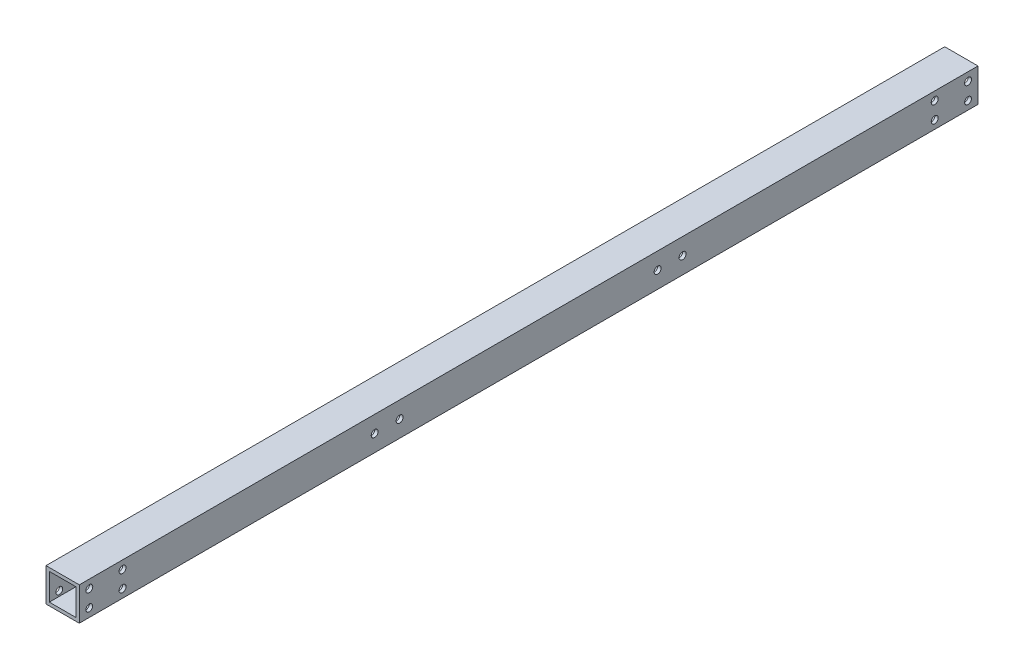
ISO-10303-21;
HEADER;
FILE_DESCRIPTION(('STEP AP214'),'2;1');
FILE_NAME('part.step','',(''),(''),'','','');
FILE_SCHEMA(('AUTOMOTIVE_DESIGN { 1 0 10303 214 1 1 1 1 }'));
ENDSEC;
DATA;
#1=APPLICATION_CONTEXT('core data for automotive mechanical design processes');
#2=APPLICATION_PROTOCOL_DEFINITION('international standard','automotive_design',2000,#1);
#3=PRODUCT_CONTEXT('',#1,'mechanical');
#4=PRODUCT('Part','Part','',(#3));
#5=PRODUCT_RELATED_PRODUCT_CATEGORY('part','',(#4));
#6=PRODUCT_DEFINITION_FORMATION('','',#4);
#7=PRODUCT_DEFINITION_CONTEXT('part definition',#1,'design');
#8=PRODUCT_DEFINITION('design','',#6,#7);
#9=PRODUCT_DEFINITION_SHAPE('','',#8);
#10=(LENGTH_UNIT() NAMED_UNIT(*) SI_UNIT(.MILLI.,.METRE.));
#11=(NAMED_UNIT(*) PLANE_ANGLE_UNIT() SI_UNIT($,.RADIAN.));
#12=(NAMED_UNIT(*) SI_UNIT($,.STERADIAN.) SOLID_ANGLE_UNIT());
#13=UNCERTAINTY_MEASURE_WITH_UNIT(LENGTH_MEASURE(1.E-05),#10,'distance_accuracy_value','');
#14=(GEOMETRIC_REPRESENTATION_CONTEXT(3) GLOBAL_UNCERTAINTY_ASSIGNED_CONTEXT((#13)) GLOBAL_UNIT_ASSIGNED_CONTEXT((#10,
#11,#12)) REPRESENTATION_CONTEXT('',''));
#15=CARTESIAN_POINT('',(0.,0.,0.));
#16=DIRECTION('',(0.,0.,1.));
#17=DIRECTION('',(1.,0.,0.));
#18=AXIS2_PLACEMENT_3D('',#15,#16,#17);
#19=CARTESIAN_POINT('',(10.,-10.,560.));
#20=DIRECTION('',(-1.,0.,0.));
#21=DIRECTION('',(0.,0.,1.));
#22=AXIS2_PLACEMENT_3D('',#19,#20,#21);
#23=PLANE('',#22);
#24=CARTESIAN_POINT('',(10.,0.,187.5));
#25=DIRECTION('',(1.,0.,0.));
#26=DIRECTION('',(0.,0.,-1.));
#27=AXIS2_PLACEMENT_3D('',#24,#25,#26);
#28=CIRCLE('',#27,2.09999999999999);
#29=CARTESIAN_POINT('',(10.,0.,185.4));
#30=VERTEX_POINT('',#29);
#31=EDGE_CURVE('E306',#30,#30,#28,.T.);
#32=ORIENTED_EDGE('',*,*,#31,.F.);
#33=EDGE_LOOP('',(#32));
#34=FACE_BOUND('',#33,.T.);
#35=CARTESIAN_POINT('',(10.,0.,202.5));
#36=DIRECTION('',(1.,0.,0.));
#37=DIRECTION('',(0.,0.,-1.));
#38=AXIS2_PLACEMENT_3D('',#35,#36,#37);
#39=CIRCLE('',#38,2.09999999999999);
#40=CARTESIAN_POINT('',(10.,0.,200.4));
#41=VERTEX_POINT('',#40);
#42=EDGE_CURVE('E310',#41,#41,#39,.T.);
#43=ORIENTED_EDGE('',*,*,#42,.F.);
#44=EDGE_LOOP('',(#43));
#45=FACE_BOUND('',#44,.T.);
#46=CARTESIAN_POINT('',(10.,0.,357.5));
#47=DIRECTION('',(1.,0.,0.));
#48=DIRECTION('',(0.,0.,1.));
#49=AXIS2_PLACEMENT_3D('',#46,#47,#48);
#50=CIRCLE('',#49,2.09999999999999);
#51=CARTESIAN_POINT('',(10.,0.,359.6));
#52=VERTEX_POINT('',#51);
#53=EDGE_CURVE('E314',#52,#52,#50,.T.);
#54=ORIENTED_EDGE('',*,*,#53,.F.);
#55=EDGE_LOOP('',(#54));
#56=FACE_BOUND('',#55,.T.);
#57=CARTESIAN_POINT('',(10.,0.,372.5));
#58=DIRECTION('',(1.,0.,0.));
#59=DIRECTION('',(0.,0.,1.));
#60=AXIS2_PLACEMENT_3D('',#57,#58,#59);
#61=CIRCLE('',#60,2.09999999999999);
#62=CARTESIAN_POINT('',(10.,0.,374.6));
#63=VERTEX_POINT('',#62);
#64=EDGE_CURVE('E318',#63,#63,#61,.T.);
#65=ORIENTED_EDGE('',*,*,#64,.F.);
#66=EDGE_LOOP('',(#65));
#67=FACE_BOUND('',#66,.T.);
#68=CARTESIAN_POINT('',(10.,5.00000000000002,543.999999999998));
#69=DIRECTION('',(1.,0.,0.));
#70=DIRECTION('',(0.,0.,1.));
#71=AXIS2_PLACEMENT_3D('',#68,#69,#70);
#72=CIRCLE('',#71,2.09999999999994);
#73=CARTESIAN_POINT('',(10.,5.00000000000002,546.099999999998));
#74=VERTEX_POINT('',#73);
#75=EDGE_CURVE('E186',#74,#74,#72,.T.);
#76=ORIENTED_EDGE('',*,*,#75,.F.);
#77=EDGE_LOOP('',(#76));
#78=FACE_BOUND('',#77,.T.);
#79=CARTESIAN_POINT('',(10.,-4.99999999999997,36.0000000000022));
#80=DIRECTION('',(1.,0.,0.));
#81=DIRECTION('',(0.,0.,-1.));
#82=AXIS2_PLACEMENT_3D('',#79,#80,#81);
#83=CIRCLE('',#82,2.1);
#84=CARTESIAN_POINT('',(10.,-4.99999999999997,33.9000000000022));
#85=VERTEX_POINT('',#84);
#86=EDGE_CURVE('E205',#85,#85,#83,.T.);
#87=ORIENTED_EDGE('',*,*,#86,.F.);
#88=EDGE_LOOP('',(#87));
#89=FACE_BOUND('',#88,.T.);
#90=CARTESIAN_POINT('',(10.,5.00000000000002,36.0000000000022));
#91=DIRECTION('',(1.,0.,0.));
#92=DIRECTION('',(0.,0.,-1.));
#93=AXIS2_PLACEMENT_3D('',#90,#91,#92);
#94=CIRCLE('',#93,2.1);
#95=CARTESIAN_POINT('',(10.,5.00000000000002,33.9000000000022));
#96=VERTEX_POINT('',#95);
#97=EDGE_CURVE('E204',#96,#96,#94,.T.);
#98=ORIENTED_EDGE('',*,*,#97,.F.);
#99=EDGE_LOOP('',(#98));
#100=FACE_BOUND('',#99,.T.);
#101=CARTESIAN_POINT('',(10.,-4.99999999999997,16.0000000000022));
#102=DIRECTION('',(1.,0.,0.));
#103=DIRECTION('',(0.,0.,-1.));
#104=AXIS2_PLACEMENT_3D('',#101,#102,#103);
#105=CIRCLE('',#104,2.03527278510448);
#106=CARTESIAN_POINT('',(10.,-4.99999999999997,13.9647272148977));
#107=VERTEX_POINT('',#106);
#108=EDGE_CURVE('E217',#107,#107,#105,.T.);
#109=ORIENTED_EDGE('',*,*,#108,.F.);
#110=EDGE_LOOP('',(#109));
#111=FACE_BOUND('',#110,.T.);
#112=CARTESIAN_POINT('',(10.,-4.99999999999997,543.999999999998));
#113=DIRECTION('',(1.,0.,0.));
#114=DIRECTION('',(0.,0.,1.));
#115=AXIS2_PLACEMENT_3D('',#112,#113,#114);
#116=CIRCLE('',#115,2.03527278510447);
#117=CARTESIAN_POINT('',(10.,-4.99999999999997,546.035272785102));
#118=VERTEX_POINT('',#117);
#119=EDGE_CURVE('E187',#118,#118,#116,.T.);
#120=ORIENTED_EDGE('',*,*,#119,.F.);
#121=EDGE_LOOP('',(#120));
#122=FACE_BOUND('',#121,.T.);
#123=CARTESIAN_POINT('',(10.,-4.99999999999997,523.999999999998));
#124=DIRECTION('',(1.,0.,0.));
#125=DIRECTION('',(0.,0.,1.));
#126=AXIS2_PLACEMENT_3D('',#123,#124,#125);
#127=CIRCLE('',#126,2.10000000000004);
#128=CARTESIAN_POINT('',(10.,-4.99999999999997,526.099999999998));
#129=VERTEX_POINT('',#128);
#130=EDGE_CURVE('E193',#129,#129,#127,.T.);
#131=ORIENTED_EDGE('',*,*,#130,.F.);
#132=EDGE_LOOP('',(#131));
#133=FACE_BOUND('',#132,.T.);
#134=CARTESIAN_POINT('',(10.,5.00000000000002,523.999999999998));
#135=DIRECTION('',(1.,0.,0.));
#136=DIRECTION('',(0.,0.,1.));
#137=AXIS2_PLACEMENT_3D('',#134,#135,#136);
#138=CIRCLE('',#137,2.10000000000004);
#139=CARTESIAN_POINT('',(10.,5.00000000000002,526.099999999998));
#140=VERTEX_POINT('',#139);
#141=EDGE_CURVE('E182',#140,#140,#138,.T.);
#142=ORIENTED_EDGE('',*,*,#141,.F.);
#143=EDGE_LOOP('',(#142));
#144=FACE_BOUND('',#143,.T.);
#145=CARTESIAN_POINT('',(10.,5.00000000000002,16.0000000000022));
#146=DIRECTION('',(1.,0.,0.));
#147=DIRECTION('',(0.,0.,-1.));
#148=AXIS2_PLACEMENT_3D('',#145,#146,#147);
#149=CIRCLE('',#148,2.1);
#150=CARTESIAN_POINT('',(10.,5.00000000000002,13.9000000000022));
#151=VERTEX_POINT('',#150);
#152=EDGE_CURVE('E216',#151,#151,#149,.T.);
#153=ORIENTED_EDGE('',*,*,#152,.F.);
#154=EDGE_LOOP('',(#153));
#155=FACE_BOUND('',#154,.T.);
#156=DIRECTION('',(0.,0.,-1.));
#157=VECTOR('',#156,1.);
#158=CARTESIAN_POINT('',(10.,10.,560.));
#159=LINE('',#158,#157);
#160=CARTESIAN_POINT('',(9.99999999999995,10.,550.));
#161=VERTEX_POINT('',#160);
#162=CARTESIAN_POINT('',(10.,10.,10.));
#163=VERTEX_POINT('',#162);
#164=EDGE_CURVE('E111',#161,#163,#159,.T.);
#165=ORIENTED_EDGE('',*,*,#164,.F.);
#166=DIRECTION('',(0.,-1.,0.));
#167=VECTOR('',#166,1.);
#168=CARTESIAN_POINT('',(9.99999999999995,-10.,550.));
#169=LINE('',#168,#167);
#170=CARTESIAN_POINT('',(9.99999999999995,-10.,550.));
#171=VERTEX_POINT('',#170);
#172=EDGE_CURVE('E97',#161,#171,#169,.T.);
#173=ORIENTED_EDGE('',*,*,#172,.T.);
#174=DIRECTION('',(0.,0.,-1.));
#175=VECTOR('',#174,1.);
#176=CARTESIAN_POINT('',(10.,-10.,560.));
#177=LINE('',#176,#175);
#178=CARTESIAN_POINT('',(10.,-10.,10.));
#179=VERTEX_POINT('',#178);
#180=EDGE_CURVE('E278',#171,#179,#177,.T.);
#181=ORIENTED_EDGE('',*,*,#180,.T.);
#182=DIRECTION('',(0.,-1.,0.));
#183=VECTOR('',#182,1.);
#184=CARTESIAN_POINT('',(10.,-10.,10.));
#185=LINE('',#184,#183);
#186=EDGE_CURVE('E117',#163,#179,#185,.T.);
#187=ORIENTED_EDGE('',*,*,#186,.F.);
#188=EDGE_LOOP('',(#165,#173,#181,#187));
#189=FACE_BOUND('',#188,.T.);
#190=ADVANCED_FACE('F34',(#34,#45,#56,#67,#78,#89,#100,#111,#122,#133,#144,#155,#189),#23,.F.);
#191=CARTESIAN_POINT('',(-9.99999999999999,10.,560.));
#192=DIRECTION('',(0.,-1.,0.));
#193=DIRECTION('',(0.,0.,-1.));
#194=AXIS2_PLACEMENT_3D('',#191,#192,#193);
#195=PLANE('',#194);
#196=DIRECTION('',(0.,0.,-1.));
#197=VECTOR('',#196,1.);
#198=CARTESIAN_POINT('',(-9.99999999999999,10.,560.));
#199=LINE('',#198,#197);
#200=CARTESIAN_POINT('',(-10.,10.,550.));
#201=VERTEX_POINT('',#200);
#202=CARTESIAN_POINT('',(-9.99999999999999,10.,10.));
#203=VERTEX_POINT('',#202);
#204=EDGE_CURVE('E113',#201,#203,#199,.T.);
#205=ORIENTED_EDGE('',*,*,#204,.F.);
#206=DIRECTION('',(1.,0.,0.));
#207=VECTOR('',#206,1.);
#208=CARTESIAN_POINT('',(9.99999999999995,10.,550.));
#209=LINE('',#208,#207);
#210=EDGE_CURVE('E100',#201,#161,#209,.T.);
#211=ORIENTED_EDGE('',*,*,#210,.T.);
#212=ORIENTED_EDGE('',*,*,#164,.T.);
#213=DIRECTION('',(1.,0.,0.));
#214=VECTOR('',#213,1.);
#215=CARTESIAN_POINT('',(10.,10.,10.));
#216=LINE('',#215,#214);
#217=EDGE_CURVE('E259',#203,#163,#216,.T.);
#218=ORIENTED_EDGE('',*,*,#217,.F.);
#219=EDGE_LOOP('',(#205,#211,#212,#218));
#220=FACE_BOUND('',#219,.T.);
#221=ADVANCED_FACE('F109',(#220),#195,.F.);
#222=CARTESIAN_POINT('',(-9.99999999999999,-10.,560.));
#223=DIRECTION('',(1.,0.,0.));
#224=DIRECTION('',(0.,0.,-1.));
#225=AXIS2_PLACEMENT_3D('',#222,#223,#224);
#226=PLANE('',#225);
#227=CARTESIAN_POINT('',(-10.,0.,187.5));
#228=DIRECTION('',(1.,0.,0.));
#229=DIRECTION('',(0.,0.,-1.));
#230=AXIS2_PLACEMENT_3D('',#227,#228,#229);
#231=CIRCLE('',#230,2.09999999999999);
#232=CARTESIAN_POINT('',(-10.,0.,185.4));
#233=VERTEX_POINT('',#232);
#234=EDGE_CURVE('E161',#233,#233,#231,.T.);
#235=ORIENTED_EDGE('',*,*,#234,.T.);
#236=EDGE_LOOP('',(#235));
#237=FACE_BOUND('',#236,.T.);
#238=CARTESIAN_POINT('',(-10.,0.,202.5));
#239=DIRECTION('',(1.,0.,0.));
#240=DIRECTION('',(0.,0.,-1.));
#241=AXIS2_PLACEMENT_3D('',#238,#239,#240);
#242=CIRCLE('',#241,2.09999999999999);
#243=CARTESIAN_POINT('',(-10.,0.,200.4));
#244=VERTEX_POINT('',#243);
#245=EDGE_CURVE('E640',#244,#244,#242,.T.);
#246=ORIENTED_EDGE('',*,*,#245,.T.);
#247=EDGE_LOOP('',(#246));
#248=FACE_BOUND('',#247,.T.);
#249=CARTESIAN_POINT('',(-10.,0.,357.5));
#250=DIRECTION('',(1.,0.,0.));
#251=DIRECTION('',(0.,0.,1.));
#252=AXIS2_PLACEMENT_3D('',#249,#250,#251);
#253=CIRCLE('',#252,2.09999999999999);
#254=CARTESIAN_POINT('',(-10.,0.,359.6));
#255=VERTEX_POINT('',#254);
#256=EDGE_CURVE('E647',#255,#255,#253,.T.);
#257=ORIENTED_EDGE('',*,*,#256,.T.);
#258=EDGE_LOOP('',(#257));
#259=FACE_BOUND('',#258,.T.);
#260=CARTESIAN_POINT('',(-10.,0.,372.5));
#261=DIRECTION('',(1.,0.,0.));
#262=DIRECTION('',(0.,0.,1.));
#263=AXIS2_PLACEMENT_3D('',#260,#261,#262);
#264=CIRCLE('',#263,2.09999999999999);
#265=CARTESIAN_POINT('',(-10.,0.,374.6));
#266=VERTEX_POINT('',#265);
#267=EDGE_CURVE('E651',#266,#266,#264,.T.);
#268=ORIENTED_EDGE('',*,*,#267,.T.);
#269=EDGE_LOOP('',(#268));
#270=FACE_BOUND('',#269,.T.);
#271=CARTESIAN_POINT('',(-10.,5.00000000000002,543.999999999998));
#272=DIRECTION('',(1.,0.,0.));
#273=DIRECTION('',(0.,0.,1.));
#274=AXIS2_PLACEMENT_3D('',#271,#272,#273);
#275=CIRCLE('',#274,2.09999999999994);
#276=CARTESIAN_POINT('',(-10.,5.00000000000002,546.099999999998));
#277=VERTEX_POINT('',#276);
#278=EDGE_CURVE('E208',#277,#277,#275,.T.);
#279=ORIENTED_EDGE('',*,*,#278,.T.);
#280=EDGE_LOOP('',(#279));
#281=FACE_BOUND('',#280,.T.);
#282=CARTESIAN_POINT('',(-10.,-4.99999999999997,36.0000000000022));
#283=DIRECTION('',(1.,0.,0.));
#284=DIRECTION('',(0.,0.,-1.));
#285=AXIS2_PLACEMENT_3D('',#282,#283,#284);
#286=CIRCLE('',#285,2.1);
#287=CARTESIAN_POINT('',(-10.,-4.99999999999997,33.9000000000022));
#288=VERTEX_POINT('',#287);
#289=EDGE_CURVE('E201',#288,#288,#286,.T.);
#290=ORIENTED_EDGE('',*,*,#289,.T.);
#291=EDGE_LOOP('',(#290));
#292=FACE_BOUND('',#291,.T.);
#293=CARTESIAN_POINT('',(-10.,5.00000000000002,36.0000000000022));
#294=DIRECTION('',(1.,0.,0.));
#295=DIRECTION('',(0.,0.,-1.));
#296=AXIS2_PLACEMENT_3D('',#293,#294,#295);
#297=CIRCLE('',#296,2.1);
#298=CARTESIAN_POINT('',(-10.,5.00000000000002,33.9000000000022));
#299=VERTEX_POINT('',#298);
#300=EDGE_CURVE('E220',#299,#299,#297,.T.);
#301=ORIENTED_EDGE('',*,*,#300,.T.);
#302=EDGE_LOOP('',(#301));
#303=FACE_BOUND('',#302,.T.);
#304=CARTESIAN_POINT('',(-10.,-4.99999999999997,16.0000000000022));
#305=DIRECTION('',(1.,0.,0.));
#306=DIRECTION('',(0.,0.,-1.));
#307=AXIS2_PLACEMENT_3D('',#304,#305,#306);
#308=CIRCLE('',#307,2.03527278510448);
#309=CARTESIAN_POINT('',(-10.,-4.99999999999997,13.9647272148977));
#310=VERTEX_POINT('',#309);
#311=EDGE_CURVE('E213',#310,#310,#308,.T.);
#312=ORIENTED_EDGE('',*,*,#311,.T.);
#313=EDGE_LOOP('',(#312));
#314=FACE_BOUND('',#313,.T.);
#315=CARTESIAN_POINT('',(-10.,-4.99999999999997,543.999999999998));
#316=DIRECTION('',(1.,0.,0.));
#317=DIRECTION('',(0.,0.,1.));
#318=AXIS2_PLACEMENT_3D('',#315,#316,#317);
#319=CIRCLE('',#318,2.03527278510447);
#320=CARTESIAN_POINT('',(-10.,-4.99999999999997,546.035272785102));
#321=VERTEX_POINT('',#320);
#322=EDGE_CURVE('E183',#321,#321,#319,.T.);
#323=ORIENTED_EDGE('',*,*,#322,.T.);
#324=EDGE_LOOP('',(#323));
#325=FACE_BOUND('',#324,.T.);
#326=CARTESIAN_POINT('',(-10.,-4.99999999999997,523.999999999998));
#327=DIRECTION('',(1.,0.,0.));
#328=DIRECTION('',(0.,0.,1.));
#329=AXIS2_PLACEMENT_3D('',#326,#327,#328);
#330=CIRCLE('',#329,2.10000000000004);
#331=CARTESIAN_POINT('',(-10.,-4.99999999999997,526.099999999998));
#332=VERTEX_POINT('',#331);
#333=EDGE_CURVE('E190',#332,#332,#330,.T.);
#334=ORIENTED_EDGE('',*,*,#333,.T.);
#335=EDGE_LOOP('',(#334));
#336=FACE_BOUND('',#335,.T.);
#337=CARTESIAN_POINT('',(-10.,5.00000000000002,523.999999999998));
#338=DIRECTION('',(1.,0.,0.));
#339=DIRECTION('',(0.,0.,1.));
#340=AXIS2_PLACEMENT_3D('',#337,#338,#339);
#341=CIRCLE('',#340,2.10000000000004);
#342=CARTESIAN_POINT('',(-10.,5.00000000000002,526.099999999998));
#343=VERTEX_POINT('',#342);
#344=EDGE_CURVE('E196',#343,#343,#341,.T.);
#345=ORIENTED_EDGE('',*,*,#344,.T.);
#346=EDGE_LOOP('',(#345));
#347=FACE_BOUND('',#346,.T.);
#348=CARTESIAN_POINT('',(-10.,5.00000000000002,16.0000000000022));
#349=DIRECTION('',(1.,0.,0.));
#350=DIRECTION('',(0.,0.,-1.));
#351=AXIS2_PLACEMENT_3D('',#348,#349,#350);
#352=CIRCLE('',#351,2.1);
#353=CARTESIAN_POINT('',(-10.,5.00000000000002,13.9000000000022));
#354=VERTEX_POINT('',#353);
#355=EDGE_CURVE('E129',#354,#354,#352,.T.);
#356=ORIENTED_EDGE('',*,*,#355,.T.);
#357=EDGE_LOOP('',(#356));
#358=FACE_BOUND('',#357,.T.);
#359=DIRECTION('',(0.,0.,-1.));
#360=VECTOR('',#359,1.);
#361=CARTESIAN_POINT('',(-9.99999999999999,-10.,560.));
#362=LINE('',#361,#360);
#363=CARTESIAN_POINT('',(-9.99999999999999,-10.,550.));
#364=VERTEX_POINT('',#363);
#365=CARTESIAN_POINT('',(-9.99999999999999,-10.,10.));
#366=VERTEX_POINT('',#365);
#367=EDGE_CURVE('E121',#364,#366,#362,.T.);
#368=ORIENTED_EDGE('',*,*,#367,.F.);
#369=DIRECTION('',(0.,1.,0.));
#370=VECTOR('',#369,1.);
#371=CARTESIAN_POINT('',(-10.,-10.,550.));
#372=LINE('',#371,#370);
#373=EDGE_CURVE('E50',#364,#201,#372,.T.);
#374=ORIENTED_EDGE('',*,*,#373,.T.);
#375=ORIENTED_EDGE('',*,*,#204,.T.);
#376=DIRECTION('',(0.,1.,0.));
#377=VECTOR('',#376,1.);
#378=CARTESIAN_POINT('',(-9.99999999999999,-10.,10.));
#379=LINE('',#378,#377);
#380=EDGE_CURVE('E256',#366,#203,#379,.T.);
#381=ORIENTED_EDGE('',*,*,#380,.F.);
#382=EDGE_LOOP('',(#368,#374,#375,#381));
#383=FACE_BOUND('',#382,.T.);
#384=ADVANCED_FACE('F287',(#237,#248,#259,#270,#281,#292,#303,#314,#325,#336,#347,#358,#383),
#226,.F.);
#385=CARTESIAN_POINT('',(-9.99999999999999,-10.,560.));
#386=DIRECTION('',(0.,1.,0.));
#387=DIRECTION('',(0.,0.,1.));
#388=AXIS2_PLACEMENT_3D('',#385,#386,#387);
#389=PLANE('',#388);
#390=ORIENTED_EDGE('',*,*,#180,.F.);
#391=DIRECTION('',(-1.,0.,0.));
#392=VECTOR('',#391,1.);
#393=CARTESIAN_POINT('',(9.99999999999995,-10.,550.));
#394=LINE('',#393,#392);
#395=EDGE_CURVE('E101',#171,#364,#394,.T.);
#396=ORIENTED_EDGE('',*,*,#395,.T.);
#397=ORIENTED_EDGE('',*,*,#367,.T.);
#398=DIRECTION('',(-1.,0.,0.));
#399=VECTOR('',#398,1.);
#400=CARTESIAN_POINT('',(10.,-10.,10.));
#401=LINE('',#400,#399);
#402=EDGE_CURVE('E253',#179,#366,#401,.T.);
#403=ORIENTED_EDGE('',*,*,#402,.F.);
#404=EDGE_LOOP('',(#390,#396,#397,#403));
#405=FACE_BOUND('',#404,.T.);
#406=ADVANCED_FACE('F282',(#405),#389,.F.);
#407=CARTESIAN_POINT('',(8.00000000000001,-8.,560.));
#408=DIRECTION('',(-1.,0.,0.));
#409=DIRECTION('',(0.,0.,1.));
#410=AXIS2_PLACEMENT_3D('',#407,#408,#409);
#411=PLANE('',#410);
#412=CARTESIAN_POINT('',(8.,0.,187.5));
#413=DIRECTION('',(-1.,0.,0.));
#414=DIRECTION('',(0.,0.,1.));
#415=AXIS2_PLACEMENT_3D('',#412,#413,#414);
#416=CIRCLE('',#415,2.09999999999999);
#417=CARTESIAN_POINT('',(8.,0.,189.6));
#418=VERTEX_POINT('',#417);
#419=EDGE_CURVE('E179',#418,#418,#416,.T.);
#420=ORIENTED_EDGE('',*,*,#419,.F.);
#421=EDGE_LOOP('',(#420));
#422=FACE_BOUND('',#421,.T.);
#423=CARTESIAN_POINT('',(8.,0.,202.5));
#424=DIRECTION('',(-1.,0.,0.));
#425=DIRECTION('',(0.,0.,1.));
#426=AXIS2_PLACEMENT_3D('',#423,#424,#425);
#427=CIRCLE('',#426,2.09999999999999);
#428=CARTESIAN_POINT('',(8.,0.,204.6));
#429=VERTEX_POINT('',#428);
#430=EDGE_CURVE('E167',#429,#429,#427,.T.);
#431=ORIENTED_EDGE('',*,*,#430,.F.);
#432=EDGE_LOOP('',(#431));
#433=FACE_BOUND('',#432,.T.);
#434=CARTESIAN_POINT('',(8.,0.,357.5));
#435=DIRECTION('',(-1.,0.,0.));
#436=DIRECTION('',(0.,0.,1.));
#437=AXIS2_PLACEMENT_3D('',#434,#435,#436);
#438=CIRCLE('',#437,2.09999999999999);
#439=CARTESIAN_POINT('',(8.,0.,359.6));
#440=VERTEX_POINT('',#439);
#441=EDGE_CURVE('E164',#440,#440,#438,.T.);
#442=ORIENTED_EDGE('',*,*,#441,.F.);
#443=EDGE_LOOP('',(#442));
#444=FACE_BOUND('',#443,.T.);
#445=CARTESIAN_POINT('',(8.,0.,372.5));
#446=DIRECTION('',(-1.,0.,0.));
#447=DIRECTION('',(0.,0.,1.));
#448=AXIS2_PLACEMENT_3D('',#445,#446,#447);
#449=CIRCLE('',#448,2.09999999999999);
#450=CARTESIAN_POINT('',(8.,0.,374.6));
#451=VERTEX_POINT('',#450);
#452=EDGE_CURVE('E160',#451,#451,#449,.T.);
#453=ORIENTED_EDGE('',*,*,#452,.F.);
#454=EDGE_LOOP('',(#453));
#455=FACE_BOUND('',#454,.T.);
#456=CARTESIAN_POINT('',(8.,5.00000000000002,543.999999999998));
#457=DIRECTION('',(-1.,0.,0.));
#458=DIRECTION('',(0.,0.,1.));
#459=AXIS2_PLACEMENT_3D('',#456,#457,#458);
#460=CIRCLE('',#459,2.09999999999994);
#461=CARTESIAN_POINT('',(8.,5.00000000000002,546.099999999998));
#462=VERTEX_POINT('',#461);
#463=EDGE_CURVE('E105',#462,#462,#460,.T.);
#464=ORIENTED_EDGE('',*,*,#463,.F.);
#465=EDGE_LOOP('',(#464));
#466=FACE_BOUND('',#465,.T.);
#467=CARTESIAN_POINT('',(8.,-4.99999999999997,36.0000000000022));
#468=DIRECTION('',(-1.,0.,0.));
#469=DIRECTION('',(0.,0.,1.));
#470=AXIS2_PLACEMENT_3D('',#467,#468,#469);
#471=CIRCLE('',#470,2.1);
#472=CARTESIAN_POINT('',(8.,-4.99999999999997,38.1000000000022));
#473=VERTEX_POINT('',#472);
#474=EDGE_CURVE('E153',#473,#473,#471,.T.);
#475=ORIENTED_EDGE('',*,*,#474,.F.);
#476=EDGE_LOOP('',(#475));
#477=FACE_BOUND('',#476,.T.);
#478=CARTESIAN_POINT('',(8.,5.00000000000002,36.0000000000022));
#479=DIRECTION('',(-1.,0.,0.));
#480=DIRECTION('',(0.,0.,1.));
#481=AXIS2_PLACEMENT_3D('',#478,#479,#480);
#482=CIRCLE('',#481,2.1);
#483=CARTESIAN_POINT('',(8.,5.00000000000002,38.1000000000022));
#484=VERTEX_POINT('',#483);
#485=EDGE_CURVE('E149',#484,#484,#482,.T.);
#486=ORIENTED_EDGE('',*,*,#485,.F.);
#487=EDGE_LOOP('',(#486));
#488=FACE_BOUND('',#487,.T.);
#489=CARTESIAN_POINT('',(8.,-4.99999999999997,16.0000000000022));
#490=DIRECTION('',(-1.,0.,0.));
#491=DIRECTION('',(0.,0.,1.));
#492=AXIS2_PLACEMENT_3D('',#489,#490,#491);
#493=CIRCLE('',#492,2.03527278510448);
#494=CARTESIAN_POINT('',(8.,-4.99999999999997,18.0352727851067));
#495=VERTEX_POINT('',#494);
#496=EDGE_CURVE('E145',#495,#495,#493,.T.);
#497=ORIENTED_EDGE('',*,*,#496,.F.);
#498=EDGE_LOOP('',(#497));
#499=FACE_BOUND('',#498,.T.);
#500=CARTESIAN_POINT('',(8.,-4.99999999999997,543.999999999998));
#501=DIRECTION('',(-1.,0.,0.));
#502=DIRECTION('',(0.,0.,1.));
#503=AXIS2_PLACEMENT_3D('',#500,#501,#502);
#504=CIRCLE('',#503,2.03527278510447);
#505=CARTESIAN_POINT('',(8.,-4.99999999999997,546.035272785102));
#506=VERTEX_POINT('',#505);
#507=EDGE_CURVE('E141',#506,#506,#504,.T.);
#508=ORIENTED_EDGE('',*,*,#507,.F.);
#509=EDGE_LOOP('',(#508));
#510=FACE_BOUND('',#509,.T.);
#511=CARTESIAN_POINT('',(8.,-4.99999999999997,523.999999999998));
#512=DIRECTION('',(-1.,0.,0.));
#513=DIRECTION('',(0.,0.,1.));
#514=AXIS2_PLACEMENT_3D('',#511,#512,#513);
#515=CIRCLE('',#514,2.10000000000004);
#516=CARTESIAN_POINT('',(8.,-4.99999999999997,526.099999999998));
#517=VERTEX_POINT('',#516);
#518=EDGE_CURVE('E137',#517,#517,#515,.T.);
#519=ORIENTED_EDGE('',*,*,#518,.F.);
#520=EDGE_LOOP('',(#519));
#521=FACE_BOUND('',#520,.T.);
#522=CARTESIAN_POINT('',(8.,5.00000000000002,523.999999999998));
#523=DIRECTION('',(-1.,0.,0.));
#524=DIRECTION('',(0.,0.,1.));
#525=AXIS2_PLACEMENT_3D('',#522,#523,#524);
#526=CIRCLE('',#525,2.10000000000004);
#527=CARTESIAN_POINT('',(8.,5.00000000000002,526.099999999998));
#528=VERTEX_POINT('',#527);
#529=EDGE_CURVE('E133',#528,#528,#526,.T.);
#530=ORIENTED_EDGE('',*,*,#529,.F.);
#531=EDGE_LOOP('',(#530));
#532=FACE_BOUND('',#531,.T.);
#533=CARTESIAN_POINT('',(8.,5.00000000000002,16.0000000000022));
#534=DIRECTION('',(-1.,0.,0.));
#535=DIRECTION('',(0.,0.,1.));
#536=AXIS2_PLACEMENT_3D('',#533,#534,#535);
#537=CIRCLE('',#536,2.1);
#538=CARTESIAN_POINT('',(8.,5.00000000000002,18.1000000000022));
#539=VERTEX_POINT('',#538);
#540=EDGE_CURVE('E128',#539,#539,#537,.T.);
#541=ORIENTED_EDGE('',*,*,#540,.F.);
#542=EDGE_LOOP('',(#541));
#543=FACE_BOUND('',#542,.T.);
#544=DIRECTION('',(0.,-1.,0.));
#545=VECTOR('',#544,1.);
#546=CARTESIAN_POINT('',(8.00000000000001,-8.,550.));
#547=LINE('',#546,#545);
#548=CARTESIAN_POINT('',(8.00000000000001,7.99999999999999,550.));
#549=VERTEX_POINT('',#548);
#550=CARTESIAN_POINT('',(8.00000000000001,-8.,550.));
#551=VERTEX_POINT('',#550);
#552=EDGE_CURVE('E57',#549,#551,#547,.T.);
#553=ORIENTED_EDGE('',*,*,#552,.F.);
#554=DIRECTION('',(0.,0.,-1.));
#555=VECTOR('',#554,1.);
#556=CARTESIAN_POINT('',(8.00000000000001,7.99999999999999,560.));
#557=LINE('',#556,#555);
#558=CARTESIAN_POINT('',(8.,7.99999999999999,10.));
#559=VERTEX_POINT('',#558);
#560=EDGE_CURVE('E276',#549,#559,#557,.T.);
#561=ORIENTED_EDGE('',*,*,#560,.T.);
#562=DIRECTION('',(0.,1.,0.));
#563=VECTOR('',#562,1.);
#564=CARTESIAN_POINT('',(8.00000000000001,-8.,10.));
#565=LINE('',#564,#563);
#566=CARTESIAN_POINT('',(8.,-8.,10.));
#567=VERTEX_POINT('',#566);
#568=EDGE_CURVE('E267',#567,#559,#565,.T.);
#569=ORIENTED_EDGE('',*,*,#568,.F.);
#570=DIRECTION('',(0.,0.,-1.));
#571=VECTOR('',#570,1.);
#572=CARTESIAN_POINT('',(8.00000000000001,-8.,560.));
#573=LINE('',#572,#571);
#574=EDGE_CURVE('E270',#551,#567,#573,.T.);
#575=ORIENTED_EDGE('',*,*,#574,.F.);
#576=EDGE_LOOP('',(#553,#561,#569,#575));
#577=FACE_BOUND('',#576,.T.);
#578=ADVANCED_FACE('F295',(#422,#433,#444,#455,#466,#477,#488,#499,#510,#521,#532,#543,#577),
#411,.T.);
#579=CARTESIAN_POINT('',(-8.,7.99999999999999,560.));
#580=DIRECTION('',(0.,-1.,0.));
#581=DIRECTION('',(0.,0.,-1.));
#582=AXIS2_PLACEMENT_3D('',#579,#580,#581);
#583=PLANE('',#582);
#584=DIRECTION('',(1.,0.,0.));
#585=VECTOR('',#584,1.);
#586=CARTESIAN_POINT('',(-7.99999999999999,7.99999999999999,550.));
#587=LINE('',#586,#585);
#588=CARTESIAN_POINT('',(-8.,7.99999999999999,550.));
#589=VERTEX_POINT('',#588);
#590=EDGE_CURVE('E249',#589,#549,#587,.T.);
#591=ORIENTED_EDGE('',*,*,#590,.F.);
#592=DIRECTION('',(0.,0.,-1.));
#593=VECTOR('',#592,1.);
#594=CARTESIAN_POINT('',(-8.,7.99999999999999,560.));
#595=LINE('',#594,#593);
#596=CARTESIAN_POINT('',(-8.,7.99999999999999,10.));
#597=VERTEX_POINT('',#596);
#598=EDGE_CURVE('E274',#589,#597,#595,.T.);
#599=ORIENTED_EDGE('',*,*,#598,.T.);
#600=DIRECTION('',(-1.,0.,0.));
#601=VECTOR('',#600,1.);
#602=CARTESIAN_POINT('',(-8.,7.99999999999999,10.));
#603=LINE('',#602,#601);
#604=EDGE_CURVE('E264',#559,#597,#603,.T.);
#605=ORIENTED_EDGE('',*,*,#604,.F.);
#606=ORIENTED_EDGE('',*,*,#560,.F.);
#607=EDGE_LOOP('',(#591,#599,#605,#606));
#608=FACE_BOUND('',#607,.T.);
#609=ADVANCED_FACE('F373',(#608),#583,.T.);
#610=CARTESIAN_POINT('',(-8.,-8.,560.));
#611=DIRECTION('',(1.,0.,0.));
#612=DIRECTION('',(0.,0.,-1.));
#613=AXIS2_PLACEMENT_3D('',#610,#611,#612);
#614=PLANE('',#613);
#615=CARTESIAN_POINT('',(-8.,0.,187.5));
#616=DIRECTION('',(1.,0.,0.));
#617=DIRECTION('',(0.,0.,-1.));
#618=AXIS2_PLACEMENT_3D('',#615,#616,#617);
#619=CIRCLE('',#618,2.09999999999999);
#620=CARTESIAN_POINT('',(-8.,0.,185.4));
#621=VERTEX_POINT('',#620);
#622=EDGE_CURVE('E37',#621,#621,#619,.T.);
#623=ORIENTED_EDGE('',*,*,#622,.F.);
#624=EDGE_LOOP('',(#623));
#625=FACE_BOUND('',#624,.T.);
#626=CARTESIAN_POINT('',(-8.,0.,202.5));
#627=DIRECTION('',(1.,0.,0.));
#628=DIRECTION('',(0.,0.,-1.));
#629=AXIS2_PLACEMENT_3D('',#626,#627,#628);
#630=CIRCLE('',#629,2.09999999999999);
#631=CARTESIAN_POINT('',(-8.,0.,200.4));
#632=VERTEX_POINT('',#631);
#633=EDGE_CURVE('E165',#632,#632,#630,.T.);
#634=ORIENTED_EDGE('',*,*,#633,.F.);
#635=EDGE_LOOP('',(#634));
#636=FACE_BOUND('',#635,.T.);
#637=CARTESIAN_POINT('',(-8.,0.,357.5));
#638=DIRECTION('',(1.,0.,0.));
#639=DIRECTION('',(0.,0.,-1.));
#640=AXIS2_PLACEMENT_3D('',#637,#638,#639);
#641=CIRCLE('',#640,2.09999999999999);
#642=CARTESIAN_POINT('',(-8.,0.,355.4));
#643=VERTEX_POINT('',#642);
#644=EDGE_CURVE('E162',#643,#643,#641,.T.);
#645=ORIENTED_EDGE('',*,*,#644,.F.);
#646=EDGE_LOOP('',(#645));
#647=FACE_BOUND('',#646,.T.);
#648=CARTESIAN_POINT('',(-8.,0.,372.5));
#649=DIRECTION('',(1.,0.,0.));
#650=DIRECTION('',(0.,0.,-1.));
#651=AXIS2_PLACEMENT_3D('',#648,#649,#650);
#652=CIRCLE('',#651,2.09999999999999);
#653=CARTESIAN_POINT('',(-8.,0.,370.4));
#654=VERTEX_POINT('',#653);
#655=EDGE_CURVE('E157',#654,#654,#652,.T.);
#656=ORIENTED_EDGE('',*,*,#655,.F.);
#657=EDGE_LOOP('',(#656));
#658=FACE_BOUND('',#657,.T.);
#659=CARTESIAN_POINT('',(-8.,5.00000000000002,543.999999999998));
#660=DIRECTION('',(1.,0.,0.));
#661=DIRECTION('',(0.,0.,-1.));
#662=AXIS2_PLACEMENT_3D('',#659,#660,#661);
#663=CIRCLE('',#662,2.09999999999994);
#664=CARTESIAN_POINT('',(-8.,5.00000000000002,541.899999999998));
#665=VERTEX_POINT('',#664);
#666=EDGE_CURVE('E154',#665,#665,#663,.T.);
#667=ORIENTED_EDGE('',*,*,#666,.F.);
#668=EDGE_LOOP('',(#667));
#669=FACE_BOUND('',#668,.T.);
#670=CARTESIAN_POINT('',(-8.,-4.99999999999997,36.0000000000022));
#671=DIRECTION('',(1.,0.,0.));
#672=DIRECTION('',(0.,0.,-1.));
#673=AXIS2_PLACEMENT_3D('',#670,#671,#672);
#674=CIRCLE('',#673,2.1);
#675=CARTESIAN_POINT('',(-8.,-4.99999999999997,33.9000000000022));
#676=VERTEX_POINT('',#675);
#677=EDGE_CURVE('E150',#676,#676,#674,.T.);
#678=ORIENTED_EDGE('',*,*,#677,.F.);
#679=EDGE_LOOP('',(#678));
#680=FACE_BOUND('',#679,.T.);
#681=CARTESIAN_POINT('',(-8.,5.00000000000002,36.0000000000022));
#682=DIRECTION('',(1.,0.,0.));
#683=DIRECTION('',(0.,0.,-1.));
#684=AXIS2_PLACEMENT_3D('',#681,#682,#683);
#685=CIRCLE('',#684,2.1);
#686=CARTESIAN_POINT('',(-8.,5.00000000000002,33.9000000000022));
#687=VERTEX_POINT('',#686);
#688=EDGE_CURVE('E146',#687,#687,#685,.T.);
#689=ORIENTED_EDGE('',*,*,#688,.F.);
#690=EDGE_LOOP('',(#689));
#691=FACE_BOUND('',#690,.T.);
#692=CARTESIAN_POINT('',(-8.,-4.99999999999997,16.0000000000022));
#693=DIRECTION('',(1.,0.,0.));
#694=DIRECTION('',(0.,0.,-1.));
#695=AXIS2_PLACEMENT_3D('',#692,#693,#694);
#696=CIRCLE('',#695,2.03527278510448);
#697=CARTESIAN_POINT('',(-8.,-4.99999999999997,13.9647272148977));
#698=VERTEX_POINT('',#697);
#699=EDGE_CURVE('E142',#698,#698,#696,.T.);
#700=ORIENTED_EDGE('',*,*,#699,.F.);
#701=EDGE_LOOP('',(#700));
#702=FACE_BOUND('',#701,.T.);
#703=CARTESIAN_POINT('',(-8.,-4.99999999999997,543.999999999998));
#704=DIRECTION('',(1.,0.,0.));
#705=DIRECTION('',(0.,0.,-1.));
#706=AXIS2_PLACEMENT_3D('',#703,#704,#705);
#707=CIRCLE('',#706,2.03527278510447);
#708=CARTESIAN_POINT('',(-8.,-4.99999999999997,541.964727214893));
#709=VERTEX_POINT('',#708);
#710=EDGE_CURVE('E138',#709,#709,#707,.T.);
#711=ORIENTED_EDGE('',*,*,#710,.F.);
#712=EDGE_LOOP('',(#711));
#713=FACE_BOUND('',#712,.T.);
#714=CARTESIAN_POINT('',(-8.,-4.99999999999997,523.999999999998));
#715=DIRECTION('',(1.,0.,0.));
#716=DIRECTION('',(0.,0.,-1.));
#717=AXIS2_PLACEMENT_3D('',#714,#715,#716);
#718=CIRCLE('',#717,2.10000000000004);
#719=CARTESIAN_POINT('',(-8.,-4.99999999999997,521.899999999998));
#720=VERTEX_POINT('',#719);
#721=EDGE_CURVE('E134',#720,#720,#718,.T.);
#722=ORIENTED_EDGE('',*,*,#721,.F.);
#723=EDGE_LOOP('',(#722));
#724=FACE_BOUND('',#723,.T.);
#725=CARTESIAN_POINT('',(-8.,5.00000000000002,523.999999999998));
#726=DIRECTION('',(1.,0.,0.));
#727=DIRECTION('',(0.,0.,-1.));
#728=AXIS2_PLACEMENT_3D('',#725,#726,#727);
#729=CIRCLE('',#728,2.10000000000004);
#730=CARTESIAN_POINT('',(-8.,5.00000000000002,521.899999999998));
#731=VERTEX_POINT('',#730);
#732=EDGE_CURVE('E130',#731,#731,#729,.T.);
#733=ORIENTED_EDGE('',*,*,#732,.F.);
#734=EDGE_LOOP('',(#733));
#735=FACE_BOUND('',#734,.T.);
#736=CARTESIAN_POINT('',(-8.,5.00000000000002,16.0000000000022));
#737=DIRECTION('',(1.,0.,0.));
#738=DIRECTION('',(0.,0.,-1.));
#739=AXIS2_PLACEMENT_3D('',#736,#737,#738);
#740=CIRCLE('',#739,2.1);
#741=CARTESIAN_POINT('',(-8.,5.00000000000002,13.9000000000022));
#742=VERTEX_POINT('',#741);
#743=EDGE_CURVE('E125',#742,#742,#740,.T.);
#744=ORIENTED_EDGE('',*,*,#743,.F.);
#745=EDGE_LOOP('',(#744));
#746=FACE_BOUND('',#745,.T.);
#747=DIRECTION('',(0.,1.,0.));
#748=VECTOR('',#747,1.);
#749=CARTESIAN_POINT('',(-8.,-8.,550.));
#750=LINE('',#749,#748);
#751=CARTESIAN_POINT('',(-8.,-8.,550.));
#752=VERTEX_POINT('',#751);
#753=EDGE_CURVE('E247',#752,#589,#750,.T.);
#754=ORIENTED_EDGE('',*,*,#753,.F.);
#755=DIRECTION('',(0.,0.,-1.));
#756=VECTOR('',#755,1.);
#757=CARTESIAN_POINT('',(-8.,-8.,560.));
#758=LINE('',#757,#756);
#759=CARTESIAN_POINT('',(-8.,-8.,10.));
#760=VERTEX_POINT('',#759);
#761=EDGE_CURVE('E272',#752,#760,#758,.T.);
#762=ORIENTED_EDGE('',*,*,#761,.T.);
#763=DIRECTION('',(0.,-1.,0.));
#764=VECTOR('',#763,1.);
#765=CARTESIAN_POINT('',(-8.,-8.,10.));
#766=LINE('',#765,#764);
#767=EDGE_CURVE('E261',#597,#760,#766,.T.);
#768=ORIENTED_EDGE('',*,*,#767,.F.);
#769=ORIENTED_EDGE('',*,*,#598,.F.);
#770=EDGE_LOOP('',(#754,#762,#768,#769));
#771=FACE_BOUND('',#770,.T.);
#772=ADVANCED_FACE('F369',(#625,#636,#647,#658,#669,#680,#691,#702,#713,#724,#735,#746,#771),
#614,.T.);
#773=CARTESIAN_POINT('',(-8.,-8.,560.));
#774=DIRECTION('',(0.,1.,0.));
#775=DIRECTION('',(0.,0.,1.));
#776=AXIS2_PLACEMENT_3D('',#773,#774,#775);
#777=PLANE('',#776);
#778=DIRECTION('',(-1.,0.,0.));
#779=VECTOR('',#778,1.);
#780=CARTESIAN_POINT('',(-7.99999999999999,-8.,550.));
#781=LINE('',#780,#779);
#782=EDGE_CURVE('E11',#551,#752,#781,.T.);
#783=ORIENTED_EDGE('',*,*,#782,.F.);
#784=ORIENTED_EDGE('',*,*,#574,.T.);
#785=DIRECTION('',(1.,0.,0.));
#786=VECTOR('',#785,1.);
#787=CARTESIAN_POINT('',(-8.,-8.,10.));
#788=LINE('',#787,#786);
#789=EDGE_CURVE('E42',#760,#567,#788,.T.);
#790=ORIENTED_EDGE('',*,*,#789,.F.);
#791=ORIENTED_EDGE('',*,*,#761,.F.);
#792=EDGE_LOOP('',(#783,#784,#790,#791));
#793=FACE_BOUND('',#792,.T.);
#794=ADVANCED_FACE('F372',(#793),#777,.T.);
#795=CARTESIAN_POINT('',(0.,0.,10.));
#796=DIRECTION('',(0.,0.,1.));
#797=DIRECTION('',(1.,0.,0.));
#798=AXIS2_PLACEMENT_3D('',#795,#796,#797);
#799=PLANE('',#798);
#800=ORIENTED_EDGE('',*,*,#568,.T.);
#801=ORIENTED_EDGE('',*,*,#604,.T.);
#802=ORIENTED_EDGE('',*,*,#767,.T.);
#803=ORIENTED_EDGE('',*,*,#789,.T.);
#804=EDGE_LOOP('',(#800,#801,#802,#803));
#805=FACE_BOUND('',#804,.T.);
#806=ORIENTED_EDGE('',*,*,#186,.T.);
#807=ORIENTED_EDGE('',*,*,#402,.T.);
#808=ORIENTED_EDGE('',*,*,#380,.T.);
#809=ORIENTED_EDGE('',*,*,#217,.T.);
#810=EDGE_LOOP('',(#806,#807,#808,#809));
#811=FACE_BOUND('',#810,.T.);
#812=ADVANCED_FACE('F286',(#805,#811),#799,.F.);
#813=CARTESIAN_POINT('',(0.,0.,550.));
#814=DIRECTION('',(0.,0.,-1.));
#815=DIRECTION('',(1.,0.,0.));
#816=AXIS2_PLACEMENT_3D('',#813,#814,#815);
#817=PLANE('',#816);
#818=ORIENTED_EDGE('',*,*,#552,.T.);
#819=ORIENTED_EDGE('',*,*,#782,.T.);
#820=ORIENTED_EDGE('',*,*,#753,.T.);
#821=ORIENTED_EDGE('',*,*,#590,.T.);
#822=EDGE_LOOP('',(#818,#819,#820,#821));
#823=FACE_BOUND('',#822,.T.);
#824=ORIENTED_EDGE('',*,*,#172,.F.);
#825=ORIENTED_EDGE('',*,*,#210,.F.);
#826=ORIENTED_EDGE('',*,*,#373,.F.);
#827=ORIENTED_EDGE('',*,*,#395,.F.);
#828=EDGE_LOOP('',(#824,#825,#826,#827));
#829=FACE_BOUND('',#828,.T.);
#830=ADVANCED_FACE('F99',(#823,#829),#817,.F.);
#831=CARTESIAN_POINT('',(-10.,5.00000000000002,16.0000000000022));
#832=DIRECTION('',(1.,0.,0.));
#833=DIRECTION('',(0.,0.,-1.));
#834=AXIS2_PLACEMENT_3D('',#831,#832,#833);
#835=CYLINDRICAL_SURFACE('',#834,2.1);
#836=ORIENTED_EDGE('',*,*,#743,.T.);
#837=EDGE_LOOP('',(#836));
#838=FACE_BOUND('',#837,.T.);
#839=ORIENTED_EDGE('',*,*,#355,.F.);
#840=EDGE_LOOP('',(#839));
#841=FACE_BOUND('',#840,.T.);
#842=ADVANCED_FACE('F341',(#838,#841),#835,.F.);
#843=CARTESIAN_POINT('',(-10.,5.00000000000002,523.999999999998));
#844=DIRECTION('',(1.,0.,0.));
#845=DIRECTION('',(0.,0.,-1.));
#846=AXIS2_PLACEMENT_3D('',#843,#844,#845);
#847=CYLINDRICAL_SURFACE('',#846,2.10000000000004);
#848=ORIENTED_EDGE('',*,*,#732,.T.);
#849=EDGE_LOOP('',(#848));
#850=FACE_BOUND('',#849,.T.);
#851=ORIENTED_EDGE('',*,*,#344,.F.);
#852=EDGE_LOOP('',(#851));
#853=FACE_BOUND('',#852,.T.);
#854=ADVANCED_FACE('F349',(#850,#853),#847,.F.);
#855=CARTESIAN_POINT('',(-10.,-4.99999999999997,523.999999999998));
#856=DIRECTION('',(1.,0.,0.));
#857=DIRECTION('',(0.,0.,-1.));
#858=AXIS2_PLACEMENT_3D('',#855,#856,#857);
#859=CYLINDRICAL_SURFACE('',#858,2.10000000000004);
#860=ORIENTED_EDGE('',*,*,#721,.T.);
#861=EDGE_LOOP('',(#860));
#862=FACE_BOUND('',#861,.T.);
#863=ORIENTED_EDGE('',*,*,#333,.F.);
#864=EDGE_LOOP('',(#863));
#865=FACE_BOUND('',#864,.T.);
#866=ADVANCED_FACE('F362',(#862,#865),#859,.F.);
#867=CARTESIAN_POINT('',(-10.,-4.99999999999997,543.999999999998));
#868=DIRECTION('',(1.,0.,0.));
#869=DIRECTION('',(0.,0.,-1.));
#870=AXIS2_PLACEMENT_3D('',#867,#868,#869);
#871=CYLINDRICAL_SURFACE('',#870,2.03527278510447);
#872=ORIENTED_EDGE('',*,*,#710,.T.);
#873=EDGE_LOOP('',(#872));
#874=FACE_BOUND('',#873,.T.);
#875=ORIENTED_EDGE('',*,*,#322,.F.);
#876=EDGE_LOOP('',(#875));
#877=FACE_BOUND('',#876,.T.);
#878=ADVANCED_FACE('F431',(#874,#877),#871,.F.);
#879=CARTESIAN_POINT('',(-10.,-4.99999999999997,16.0000000000022));
#880=DIRECTION('',(1.,0.,0.));
#881=DIRECTION('',(0.,0.,-1.));
#882=AXIS2_PLACEMENT_3D('',#879,#880,#881);
#883=CYLINDRICAL_SURFACE('',#882,2.03527278510448);
#884=ORIENTED_EDGE('',*,*,#699,.T.);
#885=EDGE_LOOP('',(#884));
#886=FACE_BOUND('',#885,.T.);
#887=ORIENTED_EDGE('',*,*,#311,.F.);
#888=EDGE_LOOP('',(#887));
#889=FACE_BOUND('',#888,.T.);
#890=ADVANCED_FACE('F441',(#886,#889),#883,.F.);
#891=CARTESIAN_POINT('',(-10.,5.00000000000002,36.0000000000022));
#892=DIRECTION('',(1.,0.,0.));
#893=DIRECTION('',(0.,0.,-1.));
#894=AXIS2_PLACEMENT_3D('',#891,#892,#893);
#895=CYLINDRICAL_SURFACE('',#894,2.1);
#896=ORIENTED_EDGE('',*,*,#688,.T.);
#897=EDGE_LOOP('',(#896));
#898=FACE_BOUND('',#897,.T.);
#899=ORIENTED_EDGE('',*,*,#300,.F.);
#900=EDGE_LOOP('',(#899));
#901=FACE_BOUND('',#900,.T.);
#902=ADVANCED_FACE('F452',(#898,#901),#895,.F.);
#903=CARTESIAN_POINT('',(-10.,-4.99999999999997,36.0000000000022));
#904=DIRECTION('',(1.,0.,0.));
#905=DIRECTION('',(0.,0.,-1.));
#906=AXIS2_PLACEMENT_3D('',#903,#904,#905);
#907=CYLINDRICAL_SURFACE('',#906,2.1);
#908=ORIENTED_EDGE('',*,*,#677,.T.);
#909=EDGE_LOOP('',(#908));
#910=FACE_BOUND('',#909,.T.);
#911=ORIENTED_EDGE('',*,*,#289,.F.);
#912=EDGE_LOOP('',(#911));
#913=FACE_BOUND('',#912,.T.);
#914=ADVANCED_FACE('F350',(#910,#913),#907,.F.);
#915=CARTESIAN_POINT('',(-10.,5.00000000000002,543.999999999998));
#916=DIRECTION('',(1.,0.,0.));
#917=DIRECTION('',(0.,0.,-1.));
#918=AXIS2_PLACEMENT_3D('',#915,#916,#917);
#919=CYLINDRICAL_SURFACE('',#918,2.09999999999994);
#920=ORIENTED_EDGE('',*,*,#666,.T.);
#921=EDGE_LOOP('',(#920));
#922=FACE_BOUND('',#921,.T.);
#923=ORIENTED_EDGE('',*,*,#278,.F.);
#924=EDGE_LOOP('',(#923));
#925=FACE_BOUND('',#924,.T.);
#926=ADVANCED_FACE('F338',(#922,#925),#919,.F.);
#927=ORIENTED_EDGE('',*,*,#540,.T.);
#928=EDGE_LOOP('',(#927));
#929=FACE_BOUND('',#928,.T.);
#930=ORIENTED_EDGE('',*,*,#152,.T.);
#931=EDGE_LOOP('',(#930));
#932=FACE_BOUND('',#931,.T.);
#933=ADVANCED_FACE('F335',(#929,#932),#835,.F.);
#934=ORIENTED_EDGE('',*,*,#529,.T.);
#935=EDGE_LOOP('',(#934));
#936=FACE_BOUND('',#935,.T.);
#937=ORIENTED_EDGE('',*,*,#141,.T.);
#938=EDGE_LOOP('',(#937));
#939=FACE_BOUND('',#938,.T.);
#940=ADVANCED_FACE('F337',(#936,#939),#847,.F.);
#941=ORIENTED_EDGE('',*,*,#518,.T.);
#942=EDGE_LOOP('',(#941));
#943=FACE_BOUND('',#942,.T.);
#944=ORIENTED_EDGE('',*,*,#130,.T.);
#945=EDGE_LOOP('',(#944));
#946=FACE_BOUND('',#945,.T.);
#947=ADVANCED_FACE('F346',(#943,#946),#859,.F.);
#948=ORIENTED_EDGE('',*,*,#507,.T.);
#949=EDGE_LOOP('',(#948));
#950=FACE_BOUND('',#949,.T.);
#951=ORIENTED_EDGE('',*,*,#119,.T.);
#952=EDGE_LOOP('',(#951));
#953=FACE_BOUND('',#952,.T.);
#954=ADVANCED_FACE('F444',(#950,#953),#871,.F.);
#955=ORIENTED_EDGE('',*,*,#496,.T.);
#956=EDGE_LOOP('',(#955));
#957=FACE_BOUND('',#956,.T.);
#958=ORIENTED_EDGE('',*,*,#108,.T.);
#959=EDGE_LOOP('',(#958));
#960=FACE_BOUND('',#959,.T.);
#961=ADVANCED_FACE('F455',(#957,#960),#883,.F.);
#962=ORIENTED_EDGE('',*,*,#485,.T.);
#963=EDGE_LOOP('',(#962));
#964=FACE_BOUND('',#963,.T.);
#965=ORIENTED_EDGE('',*,*,#97,.T.);
#966=EDGE_LOOP('',(#965));
#967=FACE_BOUND('',#966,.T.);
#968=ADVANCED_FACE('F464',(#964,#967),#895,.F.);
#969=ORIENTED_EDGE('',*,*,#474,.T.);
#970=EDGE_LOOP('',(#969));
#971=FACE_BOUND('',#970,.T.);
#972=ORIENTED_EDGE('',*,*,#86,.T.);
#973=EDGE_LOOP('',(#972));
#974=FACE_BOUND('',#973,.T.);
#975=ADVANCED_FACE('F474',(#971,#974),#907,.F.);
#976=ORIENTED_EDGE('',*,*,#463,.T.);
#977=EDGE_LOOP('',(#976));
#978=FACE_BOUND('',#977,.T.);
#979=ORIENTED_EDGE('',*,*,#75,.T.);
#980=EDGE_LOOP('',(#979));
#981=FACE_BOUND('',#980,.T.);
#982=ADVANCED_FACE('F353',(#978,#981),#919,.F.);
#983=CARTESIAN_POINT('',(-10.,0.,372.5));
#984=DIRECTION('',(1.,0.,0.));
#985=DIRECTION('',(0.,0.,-1.));
#986=AXIS2_PLACEMENT_3D('',#983,#984,#985);
#987=CYLINDRICAL_SURFACE('',#986,2.09999999999999);
#988=ORIENTED_EDGE('',*,*,#655,.T.);
#989=EDGE_LOOP('',(#988));
#990=FACE_BOUND('',#989,.T.);
#991=ORIENTED_EDGE('',*,*,#267,.F.);
#992=EDGE_LOOP('',(#991));
#993=FACE_BOUND('',#992,.T.);
#994=ADVANCED_FACE('F537',(#990,#993),#987,.F.);
#995=CARTESIAN_POINT('',(-10.,0.,357.5));
#996=DIRECTION('',(1.,0.,0.));
#997=DIRECTION('',(0.,0.,-1.));
#998=AXIS2_PLACEMENT_3D('',#995,#996,#997);
#999=CYLINDRICAL_SURFACE('',#998,2.09999999999999);
#1000=ORIENTED_EDGE('',*,*,#644,.T.);
#1001=EDGE_LOOP('',(#1000));
#1002=FACE_BOUND('',#1001,.T.);
#1003=ORIENTED_EDGE('',*,*,#256,.F.);
#1004=EDGE_LOOP('',(#1003));
#1005=FACE_BOUND('',#1004,.T.);
#1006=ADVANCED_FACE('F570',(#1002,#1005),#999,.F.);
#1007=CARTESIAN_POINT('',(-10.,0.,202.5));
#1008=DIRECTION('',(1.,0.,0.));
#1009=DIRECTION('',(0.,0.,-1.));
#1010=AXIS2_PLACEMENT_3D('',#1007,#1008,#1009);
#1011=CYLINDRICAL_SURFACE('',#1010,2.09999999999999);
#1012=ORIENTED_EDGE('',*,*,#633,.T.);
#1013=EDGE_LOOP('',(#1012));
#1014=FACE_BOUND('',#1013,.T.);
#1015=ORIENTED_EDGE('',*,*,#245,.F.);
#1016=EDGE_LOOP('',(#1015));
#1017=FACE_BOUND('',#1016,.T.);
#1018=ADVANCED_FACE('F581',(#1014,#1017),#1011,.F.);
#1019=CARTESIAN_POINT('',(-10.,0.,187.5));
#1020=DIRECTION('',(1.,0.,0.));
#1021=DIRECTION('',(0.,0.,-1.));
#1022=AXIS2_PLACEMENT_3D('',#1019,#1020,#1021);
#1023=CYLINDRICAL_SURFACE('',#1022,2.09999999999999);
#1024=ORIENTED_EDGE('',*,*,#622,.T.);
#1025=EDGE_LOOP('',(#1024));
#1026=FACE_BOUND('',#1025,.T.);
#1027=ORIENTED_EDGE('',*,*,#234,.F.);
#1028=EDGE_LOOP('',(#1027));
#1029=FACE_BOUND('',#1028,.T.);
#1030=ADVANCED_FACE('F592',(#1026,#1029),#1023,.F.);
#1031=ORIENTED_EDGE('',*,*,#452,.T.);
#1032=EDGE_LOOP('',(#1031));
#1033=FACE_BOUND('',#1032,.T.);
#1034=ORIENTED_EDGE('',*,*,#64,.T.);
#1035=EDGE_LOOP('',(#1034));
#1036=FACE_BOUND('',#1035,.T.);
#1037=ADVANCED_FACE('F573',(#1033,#1036),#987,.F.);
#1038=ORIENTED_EDGE('',*,*,#441,.T.);
#1039=EDGE_LOOP('',(#1038));
#1040=FACE_BOUND('',#1039,.T.);
#1041=ORIENTED_EDGE('',*,*,#53,.T.);
#1042=EDGE_LOOP('',(#1041));
#1043=FACE_BOUND('',#1042,.T.);
#1044=ADVANCED_FACE('F584',(#1040,#1043),#999,.F.);
#1045=ORIENTED_EDGE('',*,*,#430,.T.);
#1046=EDGE_LOOP('',(#1045));
#1047=FACE_BOUND('',#1046,.T.);
#1048=ORIENTED_EDGE('',*,*,#42,.T.);
#1049=EDGE_LOOP('',(#1048));
#1050=FACE_BOUND('',#1049,.T.);
#1051=ADVANCED_FACE('F594',(#1047,#1050),#1011,.F.);
#1052=ORIENTED_EDGE('',*,*,#419,.T.);
#1053=EDGE_LOOP('',(#1052));
#1054=FACE_BOUND('',#1053,.T.);
#1055=ORIENTED_EDGE('',*,*,#31,.T.);
#1056=EDGE_LOOP('',(#1055));
#1057=FACE_BOUND('',#1056,.T.);
#1058=ADVANCED_FACE('F604',(#1054,#1057),#1023,.F.);
#1059=CLOSED_SHELL('',(#190,#221,#384,#406,#578,#609,#772,#794,#812,#830,#842,#854,#866,#878,
#890,#902,#914,#926,#933,#940,#947,#954,#961,#968,#975,#982,#994,#1006,#1018,#1030,#1037,#1044,
#1051,#1058));
#1060=MANIFOLD_SOLID_BREP('B2',#1059);
#1061=ADVANCED_BREP_SHAPE_REPRESENTATION('',(#18,#1060),#14);
#1062=SHAPE_DEFINITION_REPRESENTATION(#9,#1061);
ENDSEC;
END-ISO-10303-21;
